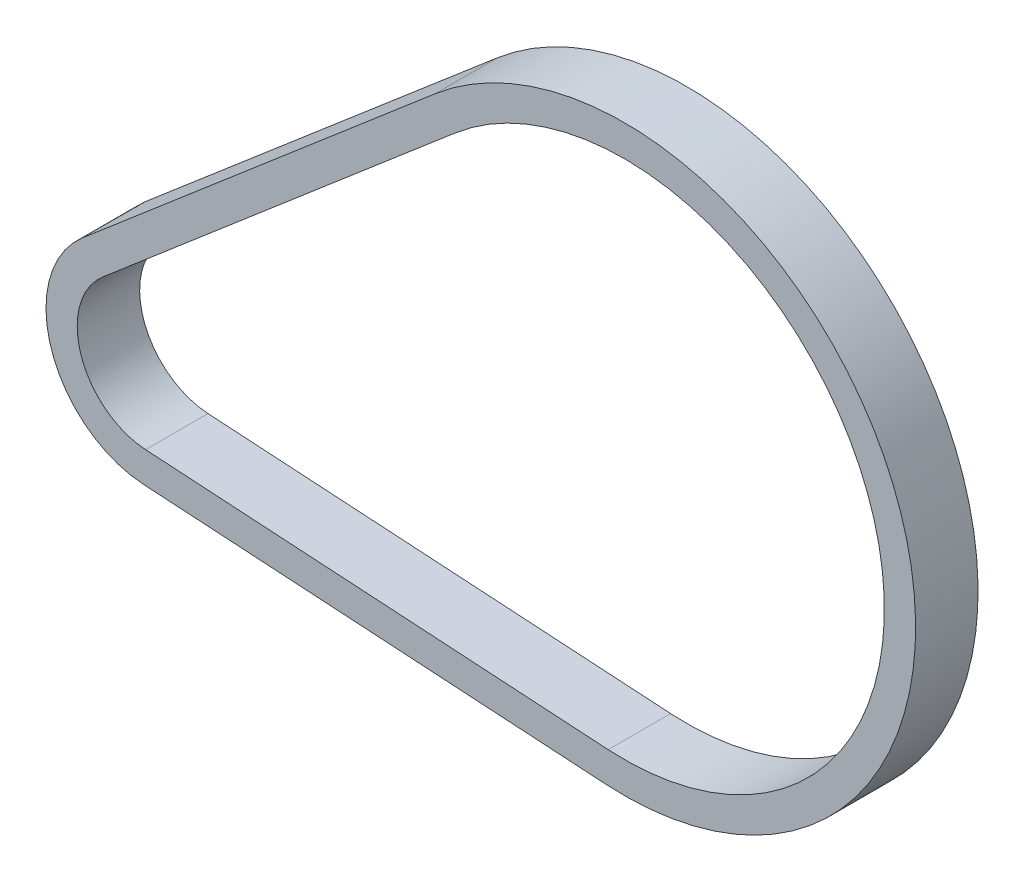
ISO-10303-21;
HEADER;
FILE_DESCRIPTION(('STEP AP214'),'2;1');
FILE_NAME('part.step','',(''),(''),'','','');
FILE_SCHEMA(('AUTOMOTIVE_DESIGN { 1 0 10303 214 1 1 1 1 }'));
ENDSEC;
DATA;
#1=APPLICATION_CONTEXT('core data for automotive mechanical design processes');
#2=APPLICATION_PROTOCOL_DEFINITION('international standard','automotive_design',2000,#1);
#3=PRODUCT_CONTEXT('',#1,'mechanical');
#4=PRODUCT('Part','Part','',(#3));
#5=PRODUCT_RELATED_PRODUCT_CATEGORY('part','',(#4));
#6=PRODUCT_DEFINITION_FORMATION('','',#4);
#7=PRODUCT_DEFINITION_CONTEXT('part definition',#1,'design');
#8=PRODUCT_DEFINITION('design','',#6,#7);
#9=PRODUCT_DEFINITION_SHAPE('','',#8);
#10=(LENGTH_UNIT() NAMED_UNIT(*) SI_UNIT(.MILLI.,.METRE.));
#11=(NAMED_UNIT(*) PLANE_ANGLE_UNIT() SI_UNIT($,.RADIAN.));
#12=(NAMED_UNIT(*) SI_UNIT($,.STERADIAN.) SOLID_ANGLE_UNIT());
#13=UNCERTAINTY_MEASURE_WITH_UNIT(LENGTH_MEASURE(1.E-05),#10,'distance_accuracy_value','');
#14=(GEOMETRIC_REPRESENTATION_CONTEXT(3) GLOBAL_UNCERTAINTY_ASSIGNED_CONTEXT((#13)) GLOBAL_UNIT_ASSIGNED_CONTEXT((#10,
#11,#12)) REPRESENTATION_CONTEXT('',''));
#15=CARTESIAN_POINT('',(0.,0.,0.));
#16=DIRECTION('',(0.,0.,1.));
#17=DIRECTION('',(1.,0.,0.));
#18=AXIS2_PLACEMENT_3D('',#15,#16,#17);
#19=CARTESIAN_POINT('',(0.,0.,-3.175));
#20=DIRECTION('',(0.,0.,1.));
#21=DIRECTION('',(1.,0.,0.));
#22=AXIS2_PLACEMENT_3D('',#19,#20,#21);
#23=CYLINDRICAL_SURFACE('',#22,29.6333333333333);
#24=DIRECTION('',(0.,0.,1.));
#25=VECTOR('',#24,1.);
#26=CARTESIAN_POINT('',(-19.2420577895249,22.5361411175256,-3.175));
#27=LINE('',#26,#25);
#28=CARTESIAN_POINT('',(-19.2420577895249,22.5361411175256,-3.175));
#29=VERTEX_POINT('',#28);
#30=CARTESIAN_POINT('',(-19.2420577895249,22.5361411175256,3.175));
#31=VERTEX_POINT('',#30);
#32=EDGE_CURVE('E96',#29,#31,#27,.T.);
#33=ORIENTED_EDGE('',*,*,#32,.T.);
#34=CARTESIAN_POINT('',(0.,0.,3.175));
#35=DIRECTION('',(0.,0.,-1.));
#36=DIRECTION('',(-1.,0.,0.));
#37=AXIS2_PLACEMENT_3D('',#34,#35,#36);
#38=CIRCLE('',#37,29.6333333333333);
#39=CARTESIAN_POINT('',(-1.8229376393083,-29.5772098550157,3.175));
#40=VERTEX_POINT('',#39);
#41=EDGE_CURVE('E194',#40,#31,#38,.F.);
#42=ORIENTED_EDGE('',*,*,#41,.F.);
#43=DIRECTION('',(0.,0.,1.));
#44=VECTOR('',#43,1.);
#45=CARTESIAN_POINT('',(-1.8229376393083,-29.5772098550157,-3.175));
#46=LINE('',#45,#44);
#47=CARTESIAN_POINT('',(-1.8229376393083,-29.5772098550157,-3.175));
#48=VERTEX_POINT('',#47);
#49=EDGE_CURVE('E12',#48,#40,#46,.T.);
#50=ORIENTED_EDGE('',*,*,#49,.F.);
#51=CARTESIAN_POINT('',(0.,0.,-3.175));
#52=DIRECTION('',(0.,0.,-1.));
#53=DIRECTION('',(-1.,0.,0.));
#54=AXIS2_PLACEMENT_3D('',#51,#52,#53);
#55=CIRCLE('',#54,29.6333333333333);
#56=EDGE_CURVE('E222',#48,#29,#55,.F.);
#57=ORIENTED_EDGE('',*,*,#56,.T.);
#58=EDGE_LOOP('',(#33,#42,#50,#57));
#59=FACE_BOUND('',#58,.T.);
#60=ADVANCED_FACE('F93',(#59),#23,.T.);
#61=CARTESIAN_POINT('',(-1.8229376393083,-29.5772098550157,-3.175));
#62=DIRECTION('',(-0.0615164557696839,-0.998106069348111,0.));
#63=DIRECTION('',(0.998106069348111,-0.0615164557696839,0.));
#64=AXIS2_PLACEMENT_3D('',#61,#62,#63);
#65=PLANE('',#64);
#66=ORIENTED_EDGE('',*,*,#49,.T.);
#67=DIRECTION('',(0.998106069348111,-0.0615164557696839,0.));
#68=VECTOR('',#67,1.);
#69=CARTESIAN_POINT('',(-1.8229376393083,-29.5772098550157,3.175));
#70=LINE('',#69,#68);
#71=CARTESIAN_POINT('',(-48.8620705001762,-26.678038289042,3.175));
#72=VERTEX_POINT('',#71);
#73=EDGE_CURVE('E206',#72,#40,#70,.T.);
#74=ORIENTED_EDGE('',*,*,#73,.F.);
#75=DIRECTION('',(0.,0.,1.));
#76=VECTOR('',#75,1.);
#77=CARTESIAN_POINT('',(-48.8620705001762,-26.678038289042,-3.175));
#78=LINE('',#77,#76);
#79=CARTESIAN_POINT('',(-48.8620705001762,-26.678038289042,-3.175));
#80=VERTEX_POINT('',#79);
#81=EDGE_CURVE('E102',#80,#72,#78,.T.);
#82=ORIENTED_EDGE('',*,*,#81,.F.);
#83=DIRECTION('',(0.998106069348111,-0.0615164557696839,0.));
#84=VECTOR('',#83,1.);
#85=CARTESIAN_POINT('',(-1.8229376393083,-29.5772098550157,-3.175));
#86=LINE('',#85,#84);
#87=EDGE_CURVE('E238',#80,#48,#86,.T.);
#88=ORIENTED_EDGE('',*,*,#87,.T.);
#89=EDGE_LOOP('',(#66,#74,#82,#88));
#90=FACE_BOUND('',#89,.T.);
#91=ADVANCED_FACE('F254',(#90),#65,.T.);
#92=CARTESIAN_POINT('',(-48.2110213432804,-16.1147490551078,-3.175));
#93=DIRECTION('',(0.,0.,1.));
#94=DIRECTION('',(1.,0.,0.));
#95=AXIS2_PLACEMENT_3D('',#92,#93,#94);
#96=CYLINDRICAL_SURFACE('',#95,10.5833333333333);
#97=ORIENTED_EDGE('',*,*,#81,.T.);
#98=CARTESIAN_POINT('',(-48.2110213432804,-16.1147490551078,3.175));
#99=DIRECTION('',(0.,0.,-1.));
#100=DIRECTION('',(-1.,0.,0.));
#101=AXIS2_PLACEMENT_3D('',#98,#99,#100);
#102=CIRCLE('',#101,10.5833333333333);
#103=CARTESIAN_POINT('',(-55.0831848395393,-8.06612722742009,3.175));
#104=VERTEX_POINT('',#103);
#105=EDGE_CURVE('E202',#104,#72,#102,.F.);
#106=ORIENTED_EDGE('',*,*,#105,.F.);
#107=DIRECTION('',(0.,0.,1.));
#108=VECTOR('',#107,1.);
#109=CARTESIAN_POINT('',(-55.0831848395393,-8.06612722742009,-3.175));
#110=LINE('',#109,#108);
#111=CARTESIAN_POINT('',(-55.0831848395393,-8.06612722742009,-3.175));
#112=VERTEX_POINT('',#111);
#113=EDGE_CURVE('E243',#112,#104,#110,.T.);
#114=ORIENTED_EDGE('',*,*,#113,.F.);
#115=CARTESIAN_POINT('',(-48.2110213432804,-16.1147490551078,-3.175));
#116=DIRECTION('',(0.,0.,-1.));
#117=DIRECTION('',(-1.,0.,0.));
#118=AXIS2_PLACEMENT_3D('',#115,#116,#117);
#119=CIRCLE('',#118,10.5833333333333);
#120=EDGE_CURVE('E234',#112,#80,#119,.F.);
#121=ORIENTED_EDGE('',*,*,#120,.T.);
#122=EDGE_LOOP('',(#97,#106,#114,#121));
#123=FACE_BOUND('',#122,.T.);
#124=ADVANCED_FACE('F260',(#123),#96,.T.);
#125=CARTESIAN_POINT('',(-19.242057789525,22.5361411175256,-3.175));
#126=DIRECTION('',(-0.649338283111078,0.760499700253957,0.));
#127=DIRECTION('',(-0.760499700253957,-0.649338283111078,0.));
#128=AXIS2_PLACEMENT_3D('',#125,#126,#127);
#129=PLANE('',#128);
#130=ORIENTED_EDGE('',*,*,#113,.T.);
#131=DIRECTION('',(-0.760499700253957,-0.649338283111078,0.));
#132=VECTOR('',#131,1.);
#133=CARTESIAN_POINT('',(-19.242057789525,22.5361411175256,3.175));
#134=LINE('',#133,#132);
#135=EDGE_CURVE('E198',#31,#104,#134,.T.);
#136=ORIENTED_EDGE('',*,*,#135,.F.);
#137=ORIENTED_EDGE('',*,*,#32,.F.);
#138=DIRECTION('',(-0.760499700253957,-0.649338283111078,0.));
#139=VECTOR('',#138,1.);
#140=CARTESIAN_POINT('',(-19.242057789525,22.5361411175256,-3.175));
#141=LINE('',#140,#139);
#142=EDGE_CURVE('E230',#29,#112,#141,.T.);
#143=ORIENTED_EDGE('',*,*,#142,.T.);
#144=EDGE_LOOP('',(#130,#136,#137,#143));
#145=FACE_BOUND('',#144,.T.);
#146=ADVANCED_FACE('F249',(#145),#129,.T.);
#147=CARTESIAN_POINT('',(0.,0.,-3.175));
#148=DIRECTION('',(0.,0.,-1.));
#149=DIRECTION('',(-1.,0.,0.));
#150=AXIS2_PLACEMENT_3D('',#147,#148,#149);
#151=PLANE('',#150);
#152=CARTESIAN_POINT('',(0.,0.,-3.175));
#153=DIRECTION('',(0.,0.,1.));
#154=DIRECTION('',(-1.,0.,0.));
#155=AXIS2_PLACEMENT_3D('',#152,#153,#154);
#156=CIRCLE('',#155,26.4583333333333);
#157=CARTESIAN_POINT('',(-1.62762289223955,-26.4082230848355,-3.175));
#158=VERTEX_POINT('',#157);
#159=CARTESIAN_POINT('',(-17.1804087406473,20.1215545692193,-3.175));
#160=VERTEX_POINT('',#159);
#161=EDGE_CURVE('E210',#158,#160,#156,.T.);
#162=ORIENTED_EDGE('',*,*,#161,.T.);
#163=DIRECTION('',(-0.760499700253957,-0.649338283111078,0.));
#164=VECTOR('',#163,1.);
#165=CARTESIAN_POINT('',(-53.0215357906617,-10.4807137757264,-3.175));
#166=LINE('',#165,#164);
#167=CARTESIAN_POINT('',(-53.0215357906617,-10.4807137757264,-3.175));
#168=VERTEX_POINT('',#167);
#169=EDGE_CURVE('E166',#160,#168,#166,.T.);
#170=ORIENTED_EDGE('',*,*,#169,.T.);
#171=CARTESIAN_POINT('',(-48.2110213432804,-16.1147490551078,-3.175));
#172=DIRECTION('',(0.,0.,1.));
#173=DIRECTION('',(-1.,0.,0.));
#174=AXIS2_PLACEMENT_3D('',#171,#172,#173);
#175=CIRCLE('',#174,7.40833333333333);
#176=CARTESIAN_POINT('',(-48.6667557531075,-23.5090515188617,-3.175));
#177=VERTEX_POINT('',#176);
#178=EDGE_CURVE('E110',#168,#177,#175,.T.);
#179=ORIENTED_EDGE('',*,*,#178,.T.);
#180=DIRECTION('',(0.998106069348111,-0.0615164557696839,0.));
#181=VECTOR('',#180,1.);
#182=CARTESIAN_POINT('',(-1.62762289223955,-26.4082230848355,-3.175));
#183=LINE('',#182,#181);
#184=EDGE_CURVE('E172',#177,#158,#183,.T.);
#185=ORIENTED_EDGE('',*,*,#184,.T.);
#186=EDGE_LOOP('',(#162,#170,#179,#185));
#187=FACE_BOUND('',#186,.T.);
#188=ORIENTED_EDGE('',*,*,#56,.F.);
#189=ORIENTED_EDGE('',*,*,#87,.F.);
#190=ORIENTED_EDGE('',*,*,#120,.F.);
#191=ORIENTED_EDGE('',*,*,#142,.F.);
#192=EDGE_LOOP('',(#188,#189,#190,#191));
#193=FACE_BOUND('',#192,.T.);
#194=ADVANCED_FACE('F258',(#187,#193),#151,.T.);
#195=CARTESIAN_POINT('',(0.,0.,-3.175));
#196=DIRECTION('',(0.,0.,1.));
#197=DIRECTION('',(1.,0.,0.));
#198=AXIS2_PLACEMENT_3D('',#195,#196,#197);
#199=CYLINDRICAL_SURFACE('',#198,26.4583333333333);
#200=DIRECTION('',(0.,0.,1.));
#201=VECTOR('',#200,1.);
#202=CARTESIAN_POINT('',(-1.62762289223955,-26.4082230848355,-3.175));
#203=LINE('',#202,#201);
#204=CARTESIAN_POINT('',(-1.62762289223955,-26.4082230848355,3.175));
#205=VERTEX_POINT('',#204);
#206=EDGE_CURVE('E177',#158,#205,#203,.T.);
#207=ORIENTED_EDGE('',*,*,#206,.T.);
#208=CARTESIAN_POINT('',(0.,0.,3.175));
#209=DIRECTION('',(0.,0.,1.));
#210=DIRECTION('',(-1.,0.,0.));
#211=AXIS2_PLACEMENT_3D('',#208,#209,#210);
#212=CIRCLE('',#211,26.4583333333333);
#213=CARTESIAN_POINT('',(-17.1804087406473,20.1215545692193,3.175));
#214=VERTEX_POINT('',#213);
#215=EDGE_CURVE('E175',#205,#214,#212,.T.);
#216=ORIENTED_EDGE('',*,*,#215,.T.);
#217=DIRECTION('',(0.,0.,1.));
#218=VECTOR('',#217,1.);
#219=CARTESIAN_POINT('',(-17.1804087406473,20.1215545692193,-3.175));
#220=LINE('',#219,#218);
#221=EDGE_CURVE('E159',#160,#214,#220,.T.);
#222=ORIENTED_EDGE('',*,*,#221,.F.);
#223=ORIENTED_EDGE('',*,*,#161,.F.);
#224=EDGE_LOOP('',(#207,#216,#222,#223));
#225=FACE_BOUND('',#224,.T.);
#226=ADVANCED_FACE('F176',(#225),#199,.F.);
#227=CARTESIAN_POINT('',(-1.62762289223955,-26.4082230848355,-3.175));
#228=DIRECTION('',(-0.0615164557696839,-0.998106069348111,0.));
#229=DIRECTION('',(0.998106069348111,-0.0615164557696839,0.));
#230=AXIS2_PLACEMENT_3D('',#227,#228,#229);
#231=PLANE('',#230);
#232=DIRECTION('',(0.,0.,1.));
#233=VECTOR('',#232,1.);
#234=CARTESIAN_POINT('',(-48.6667557531075,-23.5090515188617,-3.175));
#235=LINE('',#234,#233);
#236=CARTESIAN_POINT('',(-48.6667557531075,-23.5090515188617,3.175));
#237=VERTEX_POINT('',#236);
#238=EDGE_CURVE('E223',#177,#237,#235,.T.);
#239=ORIENTED_EDGE('',*,*,#238,.T.);
#240=DIRECTION('',(0.998106069348111,-0.0615164557696839,0.));
#241=VECTOR('',#240,1.);
#242=CARTESIAN_POINT('',(-1.62762289223955,-26.4082230848355,3.175));
#243=LINE('',#242,#241);
#244=EDGE_CURVE('E189',#237,#205,#243,.T.);
#245=ORIENTED_EDGE('',*,*,#244,.T.);
#246=ORIENTED_EDGE('',*,*,#206,.F.);
#247=ORIENTED_EDGE('',*,*,#184,.F.);
#248=EDGE_LOOP('',(#239,#245,#246,#247));
#249=FACE_BOUND('',#248,.T.);
#250=ADVANCED_FACE('F305',(#249),#231,.F.);
#251=CARTESIAN_POINT('',(-48.2110213432804,-16.1147490551078,-3.175));
#252=DIRECTION('',(0.,0.,1.));
#253=DIRECTION('',(1.,0.,0.));
#254=AXIS2_PLACEMENT_3D('',#251,#252,#253);
#255=CYLINDRICAL_SURFACE('',#254,7.40833333333333);
#256=DIRECTION('',(0.,0.,1.));
#257=VECTOR('',#256,1.);
#258=CARTESIAN_POINT('',(-53.0215357906617,-10.4807137757264,-3.175));
#259=LINE('',#258,#257);
#260=CARTESIAN_POINT('',(-53.0215357906617,-10.4807137757264,3.175));
#261=VERTEX_POINT('',#260);
#262=EDGE_CURVE('E171',#168,#261,#259,.T.);
#263=ORIENTED_EDGE('',*,*,#262,.T.);
#264=CARTESIAN_POINT('',(-48.2110213432804,-16.1147490551078,3.175));
#265=DIRECTION('',(0.,0.,1.));
#266=DIRECTION('',(-1.,0.,0.));
#267=AXIS2_PLACEMENT_3D('',#264,#265,#266);
#268=CIRCLE('',#267,7.40833333333333);
#269=EDGE_CURVE('E185',#261,#237,#268,.T.);
#270=ORIENTED_EDGE('',*,*,#269,.T.);
#271=ORIENTED_EDGE('',*,*,#238,.F.);
#272=ORIENTED_EDGE('',*,*,#178,.F.);
#273=EDGE_LOOP('',(#263,#270,#271,#272));
#274=FACE_BOUND('',#273,.T.);
#275=ADVANCED_FACE('F314',(#274),#255,.F.);
#276=CARTESIAN_POINT('',(-53.0215357906617,-10.4807137757264,-3.175));
#277=DIRECTION('',(-0.649338283111078,0.760499700253957,0.));
#278=DIRECTION('',(-0.760499700253957,-0.649338283111078,0.));
#279=AXIS2_PLACEMENT_3D('',#276,#277,#278);
#280=PLANE('',#279);
#281=ORIENTED_EDGE('',*,*,#221,.T.);
#282=DIRECTION('',(-0.760499700253957,-0.649338283111078,0.));
#283=VECTOR('',#282,1.);
#284=CARTESIAN_POINT('',(-53.0215357906617,-10.4807137757264,3.175));
#285=LINE('',#284,#283);
#286=EDGE_CURVE('E163',#214,#261,#285,.T.);
#287=ORIENTED_EDGE('',*,*,#286,.T.);
#288=ORIENTED_EDGE('',*,*,#262,.F.);
#289=ORIENTED_EDGE('',*,*,#169,.F.);
#290=EDGE_LOOP('',(#281,#287,#288,#289));
#291=FACE_BOUND('',#290,.T.);
#292=ADVANCED_FACE('F161',(#291),#280,.F.);
#293=CARTESIAN_POINT('',(0.,0.,3.175));
#294=DIRECTION('',(0.,0.,-1.));
#295=DIRECTION('',(-1.,0.,0.));
#296=AXIS2_PLACEMENT_3D('',#293,#294,#295);
#297=PLANE('',#296);
#298=ORIENTED_EDGE('',*,*,#41,.T.);
#299=ORIENTED_EDGE('',*,*,#135,.T.);
#300=ORIENTED_EDGE('',*,*,#105,.T.);
#301=ORIENTED_EDGE('',*,*,#73,.T.);
#302=EDGE_LOOP('',(#298,#299,#300,#301));
#303=FACE_BOUND('',#302,.T.);
#304=ORIENTED_EDGE('',*,*,#215,.F.);
#305=ORIENTED_EDGE('',*,*,#244,.F.);
#306=ORIENTED_EDGE('',*,*,#269,.F.);
#307=ORIENTED_EDGE('',*,*,#286,.F.);
#308=EDGE_LOOP('',(#304,#305,#306,#307));
#309=FACE_BOUND('',#308,.T.);
#310=ADVANCED_FACE('F183',(#303,#309),#297,.F.);
#311=CLOSED_SHELL('',(#60,#91,#124,#146,#194,#226,#250,#275,#292,#310));
#312=MANIFOLD_SOLID_BREP('B2',#311);
#313=ADVANCED_BREP_SHAPE_REPRESENTATION('',(#18,#312),#14);
#314=SHAPE_DEFINITION_REPRESENTATION(#9,#313);
ENDSEC;
END-ISO-10303-21;
